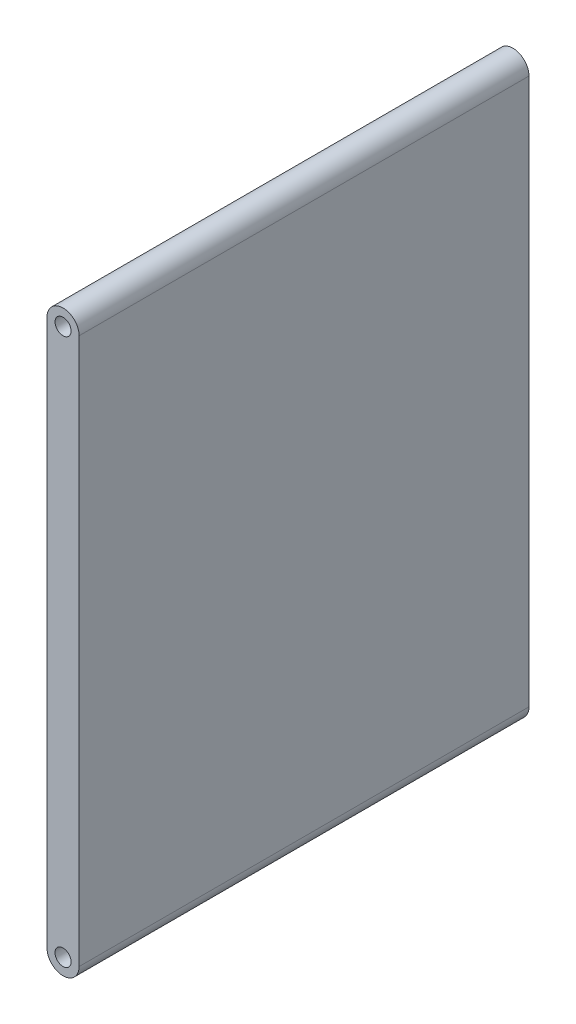
ISO-10303-21;
HEADER;
FILE_DESCRIPTION(('STEP AP214'),'2;1');
FILE_NAME('part.step','',(''),(''),'','','');
FILE_SCHEMA(('AUTOMOTIVE_DESIGN { 1 0 10303 214 1 1 1 1 }'));
ENDSEC;
DATA;
#1=APPLICATION_CONTEXT('core data for automotive mechanical design processes');
#2=APPLICATION_PROTOCOL_DEFINITION('international standard','automotive_design',2000,#1);
#3=PRODUCT_CONTEXT('',#1,'mechanical');
#4=PRODUCT('Part','Part','',(#3));
#5=PRODUCT_RELATED_PRODUCT_CATEGORY('part','',(#4));
#6=PRODUCT_DEFINITION_FORMATION('','',#4);
#7=PRODUCT_DEFINITION_CONTEXT('part definition',#1,'design');
#8=PRODUCT_DEFINITION('design','',#6,#7);
#9=PRODUCT_DEFINITION_SHAPE('','',#8);
#10=(LENGTH_UNIT() NAMED_UNIT(*) SI_UNIT(.MILLI.,.METRE.));
#11=(NAMED_UNIT(*) PLANE_ANGLE_UNIT() SI_UNIT($,.RADIAN.));
#12=(NAMED_UNIT(*) SI_UNIT($,.STERADIAN.) SOLID_ANGLE_UNIT());
#13=UNCERTAINTY_MEASURE_WITH_UNIT(LENGTH_MEASURE(1.E-05),#10,'distance_accuracy_value','');
#14=(GEOMETRIC_REPRESENTATION_CONTEXT(3) GLOBAL_UNCERTAINTY_ASSIGNED_CONTEXT((#13)) GLOBAL_UNIT_ASSIGNED_CONTEXT((#10,
#11,#12)) REPRESENTATION_CONTEXT('',''));
#15=CARTESIAN_POINT('',(0.,0.,0.));
#16=DIRECTION('',(0.,0.,1.));
#17=DIRECTION('',(1.,0.,0.));
#18=AXIS2_PLACEMENT_3D('',#15,#16,#17);
#19=CARTESIAN_POINT('',(1.,17.,28.));
#20=DIRECTION('',(0.,0.,-1.));
#21=DIRECTION('',(-1.,0.,0.));
#22=AXIS2_PLACEMENT_3D('',#19,#20,#21);
#23=PLANE('',#22);
#24=CARTESIAN_POINT('',(1.,-17.,28.));
#25=DIRECTION('',(0.,0.,-1.));
#26=DIRECTION('',(-1.,0.,0.));
#27=AXIS2_PLACEMENT_3D('',#24,#25,#26);
#28=CIRCLE('',#27,0.5);
#29=CARTESIAN_POINT('',(0.5,-17.,28.));
#30=VERTEX_POINT('',#29);
#31=EDGE_CURVE('E178',#30,#30,#28,.T.);
#32=ORIENTED_EDGE('',*,*,#31,.T.);
#33=EDGE_LOOP('',(#32));
#34=FACE_BOUND('',#33,.T.);
#35=CARTESIAN_POINT('',(1.,17.,28.));
#36=DIRECTION('',(0.,0.,-1.));
#37=DIRECTION('',(-1.,0.,0.));
#38=AXIS2_PLACEMENT_3D('',#35,#36,#37);
#39=CIRCLE('',#38,0.999999999999998);
#40=CARTESIAN_POINT('',(0.,17.,28.));
#41=VERTEX_POINT('',#40);
#42=CARTESIAN_POINT('',(2.,17.,28.));
#43=VERTEX_POINT('',#42);
#44=EDGE_CURVE('E125',#41,#43,#39,.T.);
#45=ORIENTED_EDGE('',*,*,#44,.F.);
#46=DIRECTION('',(0.,-1.,0.));
#47=VECTOR('',#46,1.);
#48=CARTESIAN_POINT('',(0.,17.,28.));
#49=LINE('',#48,#47);
#50=CARTESIAN_POINT('',(0.,-17.,28.));
#51=VERTEX_POINT('',#50);
#52=EDGE_CURVE('E115',#41,#51,#49,.T.);
#53=ORIENTED_EDGE('',*,*,#52,.T.);
#54=CARTESIAN_POINT('',(1.,-17.,28.));
#55=DIRECTION('',(0.,0.,1.));
#56=DIRECTION('',(1.,0.,0.));
#57=AXIS2_PLACEMENT_3D('',#54,#55,#56);
#58=CIRCLE('',#57,0.999999999999998);
#59=CARTESIAN_POINT('',(2.,-17.,28.));
#60=VERTEX_POINT('',#59);
#61=EDGE_CURVE('E110',#51,#60,#58,.T.);
#62=ORIENTED_EDGE('',*,*,#61,.T.);
#63=DIRECTION('',(0.,-1.,0.));
#64=VECTOR('',#63,1.);
#65=CARTESIAN_POINT('',(2.,17.,28.));
#66=LINE('',#65,#64);
#67=EDGE_CURVE('E114',#43,#60,#66,.T.);
#68=ORIENTED_EDGE('',*,*,#67,.F.);
#69=EDGE_LOOP('',(#45,#53,#62,#68));
#70=FACE_BOUND('',#69,.T.);
#71=CARTESIAN_POINT('',(1.,17.,28.));
#72=DIRECTION('',(0.,0.,1.));
#73=DIRECTION('',(1.,0.,0.));
#74=AXIS2_PLACEMENT_3D('',#71,#72,#73);
#75=CIRCLE('',#74,0.5);
#76=CARTESIAN_POINT('',(1.5,17.,28.));
#77=VERTEX_POINT('',#76);
#78=EDGE_CURVE('E135',#77,#77,#75,.T.);
#79=ORIENTED_EDGE('',*,*,#78,.F.);
#80=EDGE_LOOP('',(#79));
#81=FACE_BOUND('',#80,.T.);
#82=ADVANCED_FACE('F64',(#34,#70,#81),#23,.F.);
#83=CARTESIAN_POINT('',(1.,17.,0.));
#84=DIRECTION('',(0.,0.,-1.));
#85=DIRECTION('',(-1.,0.,0.));
#86=AXIS2_PLACEMENT_3D('',#83,#84,#85);
#87=PLANE('',#86);
#88=CARTESIAN_POINT('',(1.,-17.,0.));
#89=DIRECTION('',(0.,0.,-1.));
#90=DIRECTION('',(-1.,0.,0.));
#91=AXIS2_PLACEMENT_3D('',#88,#89,#90);
#92=CIRCLE('',#91,0.5);
#93=CARTESIAN_POINT('',(0.5,-17.,0.));
#94=VERTEX_POINT('',#93);
#95=EDGE_CURVE('E180',#94,#94,#92,.T.);
#96=ORIENTED_EDGE('',*,*,#95,.F.);
#97=EDGE_LOOP('',(#96));
#98=FACE_BOUND('',#97,.T.);
#99=CARTESIAN_POINT('',(1.,17.,0.));
#100=DIRECTION('',(0.,0.,-1.));
#101=DIRECTION('',(-1.,0.,0.));
#102=AXIS2_PLACEMENT_3D('',#99,#100,#101);
#103=CIRCLE('',#102,0.999999999999998);
#104=CARTESIAN_POINT('',(0.,17.,0.));
#105=VERTEX_POINT('',#104);
#106=CARTESIAN_POINT('',(2.,17.,0.));
#107=VERTEX_POINT('',#106);
#108=EDGE_CURVE('E131',#105,#107,#103,.T.);
#109=ORIENTED_EDGE('',*,*,#108,.T.);
#110=DIRECTION('',(0.,-1.,0.));
#111=VECTOR('',#110,1.);
#112=CARTESIAN_POINT('',(2.,17.,0.));
#113=LINE('',#112,#111);
#114=CARTESIAN_POINT('',(2.,-17.,0.));
#115=VERTEX_POINT('',#114);
#116=EDGE_CURVE('E134',#107,#115,#113,.T.);
#117=ORIENTED_EDGE('',*,*,#116,.T.);
#118=CARTESIAN_POINT('',(1.,-17.,0.));
#119=DIRECTION('',(0.,0.,1.));
#120=DIRECTION('',(1.,0.,0.));
#121=AXIS2_PLACEMENT_3D('',#118,#119,#120);
#122=CIRCLE('',#121,0.999999999999998);
#123=CARTESIAN_POINT('',(0.,-17.,0.));
#124=VERTEX_POINT('',#123);
#125=EDGE_CURVE('E122',#124,#115,#122,.T.);
#126=ORIENTED_EDGE('',*,*,#125,.F.);
#127=DIRECTION('',(0.,-1.,0.));
#128=VECTOR('',#127,1.);
#129=CARTESIAN_POINT('',(0.,17.,0.));
#130=LINE('',#129,#128);
#131=EDGE_CURVE('E98',#105,#124,#130,.T.);
#132=ORIENTED_EDGE('',*,*,#131,.F.);
#133=EDGE_LOOP('',(#109,#117,#126,#132));
#134=FACE_BOUND('',#133,.T.);
#135=CARTESIAN_POINT('',(1.,17.,0.));
#136=DIRECTION('',(0.,0.,1.));
#137=DIRECTION('',(1.,0.,0.));
#138=AXIS2_PLACEMENT_3D('',#135,#136,#137);
#139=CIRCLE('',#138,0.5);
#140=CARTESIAN_POINT('',(1.5,17.,0.));
#141=VERTEX_POINT('',#140);
#142=EDGE_CURVE('E177',#141,#141,#139,.T.);
#143=ORIENTED_EDGE('',*,*,#142,.T.);
#144=EDGE_LOOP('',(#143));
#145=FACE_BOUND('',#144,.T.);
#146=ADVANCED_FACE('F140',(#98,#134,#145),#87,.T.);
#147=CARTESIAN_POINT('',(1.,17.,28.));
#148=DIRECTION('',(0.,0.,-1.));
#149=DIRECTION('',(-1.,0.,0.));
#150=AXIS2_PLACEMENT_3D('',#147,#148,#149);
#151=CYLINDRICAL_SURFACE('',#150,0.999999999999998);
#152=ORIENTED_EDGE('',*,*,#108,.F.);
#153=DIRECTION('',(0.,0.,-1.));
#154=VECTOR('',#153,1.);
#155=CARTESIAN_POINT('',(0.,17.,28.));
#156=LINE('',#155,#154);
#157=EDGE_CURVE('E12',#41,#105,#156,.T.);
#158=ORIENTED_EDGE('',*,*,#157,.F.);
#159=ORIENTED_EDGE('',*,*,#44,.T.);
#160=DIRECTION('',(0.,0.,-1.));
#161=VECTOR('',#160,1.);
#162=CARTESIAN_POINT('',(2.,17.,28.));
#163=LINE('',#162,#161);
#164=EDGE_CURVE('E68',#43,#107,#163,.T.);
#165=ORIENTED_EDGE('',*,*,#164,.T.);
#166=EDGE_LOOP('',(#152,#158,#159,#165));
#167=FACE_BOUND('',#166,.T.);
#168=ADVANCED_FACE('F66',(#167),#151,.T.);
#169=CARTESIAN_POINT('',(0.,17.,28.));
#170=DIRECTION('',(1.,0.,0.));
#171=DIRECTION('',(0.,0.,-1.));
#172=AXIS2_PLACEMENT_3D('',#169,#170,#171);
#173=PLANE('',#172);
#174=ORIENTED_EDGE('',*,*,#131,.T.);
#175=DIRECTION('',(0.,0.,-1.));
#176=VECTOR('',#175,1.);
#177=CARTESIAN_POINT('',(0.,-17.,28.));
#178=LINE('',#177,#176);
#179=EDGE_CURVE('E74',#51,#124,#178,.T.);
#180=ORIENTED_EDGE('',*,*,#179,.F.);
#181=ORIENTED_EDGE('',*,*,#52,.F.);
#182=ORIENTED_EDGE('',*,*,#157,.T.);
#183=EDGE_LOOP('',(#174,#180,#181,#182));
#184=FACE_BOUND('',#183,.T.);
#185=ADVANCED_FACE('F143',(#184),#173,.F.);
#186=CARTESIAN_POINT('',(1.,-17.,28.));
#187=DIRECTION('',(0.,0.,-1.));
#188=DIRECTION('',(-1.,0.,0.));
#189=AXIS2_PLACEMENT_3D('',#186,#187,#188);
#190=CYLINDRICAL_SURFACE('',#189,0.999999999999998);
#191=ORIENTED_EDGE('',*,*,#125,.T.);
#192=DIRECTION('',(0.,0.,-1.));
#193=VECTOR('',#192,1.);
#194=CARTESIAN_POINT('',(2.,-17.,28.));
#195=LINE('',#194,#193);
#196=EDGE_CURVE('E119',#60,#115,#195,.T.);
#197=ORIENTED_EDGE('',*,*,#196,.F.);
#198=ORIENTED_EDGE('',*,*,#61,.F.);
#199=ORIENTED_EDGE('',*,*,#179,.T.);
#200=EDGE_LOOP('',(#191,#197,#198,#199));
#201=FACE_BOUND('',#200,.T.);
#202=ADVANCED_FACE('F120',(#201),#190,.T.);
#203=CARTESIAN_POINT('',(2.,17.,28.));
#204=DIRECTION('',(1.,0.,0.));
#205=DIRECTION('',(0.,0.,-1.));
#206=AXIS2_PLACEMENT_3D('',#203,#204,#205);
#207=PLANE('',#206);
#208=ORIENTED_EDGE('',*,*,#116,.F.);
#209=ORIENTED_EDGE('',*,*,#164,.F.);
#210=ORIENTED_EDGE('',*,*,#67,.T.);
#211=ORIENTED_EDGE('',*,*,#196,.T.);
#212=EDGE_LOOP('',(#208,#209,#210,#211));
#213=FACE_BOUND('',#212,.T.);
#214=ADVANCED_FACE('F124',(#213),#207,.T.);
#215=CARTESIAN_POINT('',(1.,17.,28.));
#216=DIRECTION('',(0.,0.,-1.));
#217=DIRECTION('',(-1.,0.,0.));
#218=AXIS2_PLACEMENT_3D('',#215,#216,#217);
#219=CYLINDRICAL_SURFACE('',#218,0.5);
#220=ORIENTED_EDGE('',*,*,#78,.T.);
#221=EDGE_LOOP('',(#220));
#222=FACE_BOUND('',#221,.T.);
#223=ORIENTED_EDGE('',*,*,#142,.F.);
#224=EDGE_LOOP('',(#223));
#225=FACE_BOUND('',#224,.T.);
#226=ADVANCED_FACE('F158',(#222,#225),#219,.F.);
#227=CARTESIAN_POINT('',(1.,-17.,28.));
#228=DIRECTION('',(0.,0.,-1.));
#229=DIRECTION('',(-1.,0.,0.));
#230=AXIS2_PLACEMENT_3D('',#227,#228,#229);
#231=CYLINDRICAL_SURFACE('',#230,0.5);
#232=ORIENTED_EDGE('',*,*,#31,.F.);
#233=EDGE_LOOP('',(#232));
#234=FACE_BOUND('',#233,.T.);
#235=ORIENTED_EDGE('',*,*,#95,.T.);
#236=EDGE_LOOP('',(#235));
#237=FACE_BOUND('',#236,.T.);
#238=ADVANCED_FACE('F166',(#234,#237),#231,.F.);
#239=CLOSED_SHELL('',(#82,#146,#168,#185,#202,#214,#226,#238));
#240=MANIFOLD_SOLID_BREP('B2',#239);
#241=ADVANCED_BREP_SHAPE_REPRESENTATION('',(#18,#240),#14);
#242=SHAPE_DEFINITION_REPRESENTATION(#9,#241);
ENDSEC;
END-ISO-10303-21;
